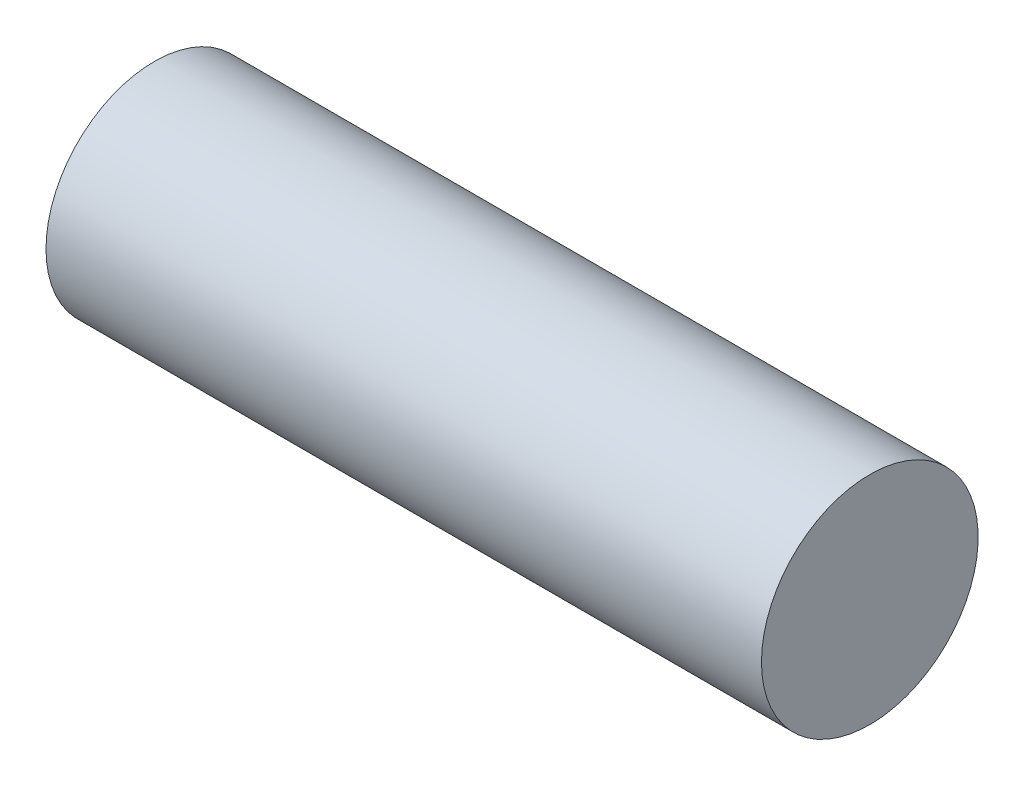
ISO-10303-21;
HEADER;
FILE_DESCRIPTION(('STEP AP214'),'2;1');
FILE_NAME('part.step','',(''),(''),'','','');
FILE_SCHEMA(('AUTOMOTIVE_DESIGN { 1 0 10303 214 1 1 1 1 }'));
ENDSEC;
DATA;
#1=APPLICATION_CONTEXT('core data for automotive mechanical design processes');
#2=APPLICATION_PROTOCOL_DEFINITION('international standard','automotive_design',2000,#1);
#3=PRODUCT_CONTEXT('',#1,'mechanical');
#4=PRODUCT('Part','Part','',(#3));
#5=PRODUCT_RELATED_PRODUCT_CATEGORY('part','',(#4));
#6=PRODUCT_DEFINITION_FORMATION('','',#4);
#7=PRODUCT_DEFINITION_CONTEXT('part definition',#1,'design');
#8=PRODUCT_DEFINITION('design','',#6,#7);
#9=PRODUCT_DEFINITION_SHAPE('','',#8);
#10=(LENGTH_UNIT() NAMED_UNIT(*) SI_UNIT(.MILLI.,.METRE.));
#11=(NAMED_UNIT(*) PLANE_ANGLE_UNIT() SI_UNIT($,.RADIAN.));
#12=(NAMED_UNIT(*) SI_UNIT($,.STERADIAN.) SOLID_ANGLE_UNIT());
#13=UNCERTAINTY_MEASURE_WITH_UNIT(LENGTH_MEASURE(1.E-05),#10,'distance_accuracy_value','');
#14=(GEOMETRIC_REPRESENTATION_CONTEXT(3) GLOBAL_UNCERTAINTY_ASSIGNED_CONTEXT((#13)) GLOBAL_UNIT_ASSIGNED_CONTEXT((#10,
#11,#12)) REPRESENTATION_CONTEXT('',''));
#15=CARTESIAN_POINT('',(0.,0.,0.));
#16=DIRECTION('',(0.,0.,1.));
#17=DIRECTION('',(1.,0.,0.));
#18=AXIS2_PLACEMENT_3D('',#15,#16,#17);
#19=CARTESIAN_POINT('',(-35.,10.6,0.));
#20=DIRECTION('',(1.,0.,0.));
#21=DIRECTION('',(0.,0.,-1.));
#22=AXIS2_PLACEMENT_3D('',#19,#20,#21);
#23=PLANE('',#22);
#24=CARTESIAN_POINT('',(-35.,0.,0.));
#25=DIRECTION('',(-1.,0.,0.));
#26=DIRECTION('',(0.,0.,1.));
#27=AXIS2_PLACEMENT_3D('',#24,#25,#26);
#28=CIRCLE('',#27,10.6);
#29=CARTESIAN_POINT('',(-35.,0.,10.6));
#30=VERTEX_POINT('',#29);
#31=EDGE_CURVE('E43',#30,#30,#28,.T.);
#32=ORIENTED_EDGE('',*,*,#31,.T.);
#33=EDGE_LOOP('',(#32));
#34=FACE_BOUND('',#33,.T.);
#35=ADVANCED_FACE('F37',(#34),#23,.F.);
#36=CARTESIAN_POINT('',(35.,10.6,0.));
#37=DIRECTION('',(-1.,0.,0.));
#38=DIRECTION('',(0.,0.,1.));
#39=AXIS2_PLACEMENT_3D('',#36,#37,#38);
#40=PLANE('',#39);
#41=CARTESIAN_POINT('',(35.,0.,0.));
#42=DIRECTION('',(-1.,0.,0.));
#43=DIRECTION('',(0.,0.,1.));
#44=AXIS2_PLACEMENT_3D('',#41,#42,#43);
#45=CIRCLE('',#44,10.6);
#46=CARTESIAN_POINT('',(35.,0.,10.6));
#47=VERTEX_POINT('',#46);
#48=EDGE_CURVE('E10',#47,#47,#45,.T.);
#49=ORIENTED_EDGE('',*,*,#48,.F.);
#50=EDGE_LOOP('',(#49));
#51=FACE_BOUND('',#50,.T.);
#52=ADVANCED_FACE('F52',(#51),#40,.F.);
#53=CARTESIAN_POINT('',(-35.,0.,0.));
#54=DIRECTION('',(-1.,0.,0.));
#55=DIRECTION('',(0.,0.,1.));
#56=AXIS2_PLACEMENT_3D('',#53,#54,#55);
#57=CYLINDRICAL_SURFACE('',#56,10.6);
#58=ORIENTED_EDGE('',*,*,#31,.F.);
#59=EDGE_LOOP('',(#58));
#60=FACE_BOUND('',#59,.T.);
#61=ORIENTED_EDGE('',*,*,#48,.T.);
#62=EDGE_LOOP('',(#61));
#63=FACE_BOUND('',#62,.T.);
#64=ADVANCED_FACE('F50',(#60,#63),#57,.T.);
#65=CLOSED_SHELL('',(#35,#52,#64));
#66=MANIFOLD_SOLID_BREP('B2',#65);
#67=ADVANCED_BREP_SHAPE_REPRESENTATION('',(#18,#66),#14);
#68=SHAPE_DEFINITION_REPRESENTATION(#9,#67);
ENDSEC;
END-ISO-10303-21;
